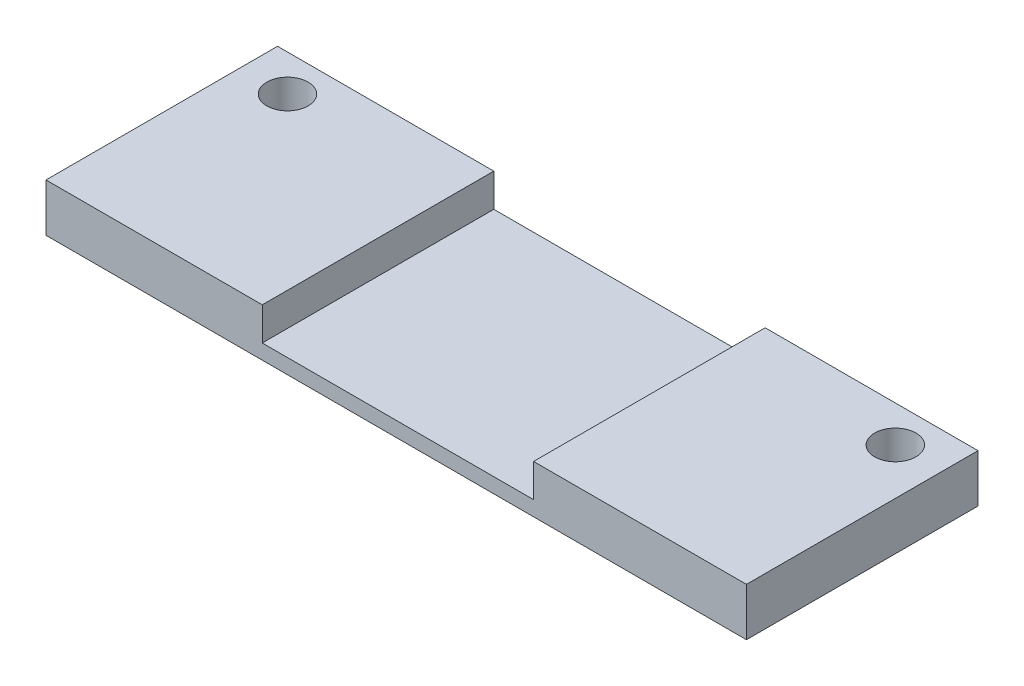
ISO-10303-21;
HEADER;
FILE_DESCRIPTION(('STEP AP214'),'2;1');
FILE_NAME('part.step','',(''),(''),'','','');
FILE_SCHEMA(('AUTOMOTIVE_DESIGN { 1 0 10303 214 1 1 1 1 }'));
ENDSEC;
DATA;
#1=APPLICATION_CONTEXT('core data for automotive mechanical design processes');
#2=APPLICATION_PROTOCOL_DEFINITION('international standard','automotive_design',2000,#1);
#3=PRODUCT_CONTEXT('',#1,'mechanical');
#4=PRODUCT('Part','Part','',(#3));
#5=PRODUCT_RELATED_PRODUCT_CATEGORY('part','',(#4));
#6=PRODUCT_DEFINITION_FORMATION('','',#4);
#7=PRODUCT_DEFINITION_CONTEXT('part definition',#1,'design');
#8=PRODUCT_DEFINITION('design','',#6,#7);
#9=PRODUCT_DEFINITION_SHAPE('','',#8);
#10=(LENGTH_UNIT() NAMED_UNIT(*) SI_UNIT(.MILLI.,.METRE.));
#11=(NAMED_UNIT(*) PLANE_ANGLE_UNIT() SI_UNIT($,.RADIAN.));
#12=(NAMED_UNIT(*) SI_UNIT($,.STERADIAN.) SOLID_ANGLE_UNIT());
#13=UNCERTAINTY_MEASURE_WITH_UNIT(LENGTH_MEASURE(1.E-05),#10,'distance_accuracy_value','');
#14=(GEOMETRIC_REPRESENTATION_CONTEXT(3) GLOBAL_UNCERTAINTY_ASSIGNED_CONTEXT((#13)) GLOBAL_UNIT_ASSIGNED_CONTEXT((#10,
#11,#12)) REPRESENTATION_CONTEXT('',''));
#15=CARTESIAN_POINT('',(0.,0.,0.));
#16=DIRECTION('',(0.,0.,1.));
#17=DIRECTION('',(1.,0.,0.));
#18=AXIS2_PLACEMENT_3D('',#15,#16,#17);
#19=CARTESIAN_POINT('',(-1.43093246882604,2.9,0.));
#20=DIRECTION('',(1.,0.,0.));
#21=DIRECTION('',(0.,0.,-1.));
#22=AXIS2_PLACEMENT_3D('',#19,#20,#21);
#23=PLANE('',#22);
#24=DIRECTION('',(0.,0.,1.));
#25=VECTOR('',#24,1.);
#26=CARTESIAN_POINT('',(-1.43093246882604,0.9,0.));
#27=LINE('',#26,#25);
#28=CARTESIAN_POINT('',(-1.43093246882604,0.9,-5.4506491156257));
#29=VERTEX_POINT('',#28);
#30=CARTESIAN_POINT('',(-1.43093246882604,0.9,8.54935088437429));
#31=VERTEX_POINT('',#30);
#32=EDGE_CURVE('E58',#29,#31,#27,.T.);
#33=ORIENTED_EDGE('',*,*,#32,.F.);
#34=DIRECTION('',(0.,-1.,0.));
#35=VECTOR('',#34,1.);
#36=CARTESIAN_POINT('',(-1.43093246882604,2.9,-5.4506491156257));
#37=LINE('',#36,#35);
#38=CARTESIAN_POINT('',(-1.43093246882604,2.9,-5.4506491156257));
#39=VERTEX_POINT('',#38);
#40=EDGE_CURVE('E11',#39,#29,#37,.T.);
#41=ORIENTED_EDGE('',*,*,#40,.F.);
#42=DIRECTION('',(0.,0.,1.));
#43=VECTOR('',#42,1.);
#44=CARTESIAN_POINT('',(-1.43093246882604,2.9,0.));
#45=LINE('',#44,#43);
#46=CARTESIAN_POINT('',(-1.43093246882604,2.9,8.54935088437429));
#47=VERTEX_POINT('',#46);
#48=EDGE_CURVE('E168',#39,#47,#45,.T.);
#49=ORIENTED_EDGE('',*,*,#48,.T.);
#50=DIRECTION('',(0.,-1.,0.));
#51=VECTOR('',#50,1.);
#52=CARTESIAN_POINT('',(-1.43093246882604,2.9,8.54935088437429));
#53=LINE('',#52,#51);
#54=EDGE_CURVE('E176',#47,#31,#53,.T.);
#55=ORIENTED_EDGE('',*,*,#54,.T.);
#56=EDGE_LOOP('',(#33,#41,#49,#55));
#57=FACE_BOUND('',#56,.T.);
#58=ADVANCED_FACE('F43',(#57),#23,.T.);
#59=CARTESIAN_POINT('',(0.,2.9,-5.45064911562571));
#60=DIRECTION('',(0.,0.,-1.));
#61=DIRECTION('',(-1.,0.,0.));
#62=AXIS2_PLACEMENT_3D('',#59,#60,#61);
#63=PLANE('',#62);
#64=DIRECTION('',(1.,0.,0.));
#65=VECTOR('',#64,1.);
#66=CARTESIAN_POINT('',(0.,0.,-5.45064911562571));
#67=LINE('',#66,#65);
#68=CARTESIAN_POINT('',(-14.505932468826,0.,-5.45064911562571));
#69=VERTEX_POINT('',#68);
#70=CARTESIAN_POINT('',(27.844067531174,0.,-5.45064911562571));
#71=VERTEX_POINT('',#70);
#72=EDGE_CURVE('E179',#69,#71,#67,.T.);
#73=ORIENTED_EDGE('',*,*,#72,.F.);
#74=DIRECTION('',(0.,-1.,0.));
#75=VECTOR('',#74,1.);
#76=CARTESIAN_POINT('',(-14.505932468826,2.9,-5.45064911562571));
#77=LINE('',#76,#75);
#78=CARTESIAN_POINT('',(-14.505932468826,2.9,-5.45064911562571));
#79=VERTEX_POINT('',#78);
#80=EDGE_CURVE('E51',#79,#69,#77,.T.);
#81=ORIENTED_EDGE('',*,*,#80,.F.);
#82=DIRECTION('',(1.,0.,0.));
#83=VECTOR('',#82,1.);
#84=CARTESIAN_POINT('',(0.,2.9,-5.45064911562571));
#85=LINE('',#84,#83);
#86=EDGE_CURVE('E170',#79,#39,#85,.T.);
#87=ORIENTED_EDGE('',*,*,#86,.T.);
#88=ORIENTED_EDGE('',*,*,#40,.T.);
#89=DIRECTION('',(1.,0.,0.));
#90=VECTOR('',#89,1.);
#91=CARTESIAN_POINT('',(0.,0.9,-5.45064911562571));
#92=LINE('',#91,#90);
#93=CARTESIAN_POINT('',(14.9729696775593,0.9,-5.45064911562571));
#94=VERTEX_POINT('',#93);
#95=EDGE_CURVE('E124',#29,#94,#92,.T.);
#96=ORIENTED_EDGE('',*,*,#95,.T.);
#97=DIRECTION('',(0.,-1.,0.));
#98=VECTOR('',#97,1.);
#99=CARTESIAN_POINT('',(14.9729696775593,2.9,-5.45064911562571));
#100=LINE('',#99,#98);
#101=CARTESIAN_POINT('',(14.9729696775593,2.9,-5.45064911562571));
#102=VERTEX_POINT('',#101);
#103=EDGE_CURVE('E115',#102,#94,#100,.T.);
#104=ORIENTED_EDGE('',*,*,#103,.F.);
#105=DIRECTION('',(1.,0.,0.));
#106=VECTOR('',#105,1.);
#107=CARTESIAN_POINT('',(0.,2.9,-5.45064911562571));
#108=LINE('',#107,#106);
#109=CARTESIAN_POINT('',(27.844067531174,2.9,-5.45064911562571));
#110=VERTEX_POINT('',#109);
#111=EDGE_CURVE('E121',#102,#110,#108,.T.);
#112=ORIENTED_EDGE('',*,*,#111,.T.);
#113=DIRECTION('',(0.,-1.,0.));
#114=VECTOR('',#113,1.);
#115=CARTESIAN_POINT('',(27.844067531174,2.9,-5.45064911562571));
#116=LINE('',#115,#114);
#117=EDGE_CURVE('E149',#110,#71,#116,.T.);
#118=ORIENTED_EDGE('',*,*,#117,.T.);
#119=EDGE_LOOP('',(#73,#81,#87,#88,#96,#104,#112,#118));
#120=FACE_BOUND('',#119,.T.);
#121=ADVANCED_FACE('F118',(#120),#63,.T.);
#122=CARTESIAN_POINT('',(-14.505932468826,2.9,0.));
#123=DIRECTION('',(1.,0.,0.));
#124=DIRECTION('',(0.,0.,-1.));
#125=AXIS2_PLACEMENT_3D('',#122,#123,#124);
#126=PLANE('',#125);
#127=DIRECTION('',(0.,0.,1.));
#128=VECTOR('',#127,1.);
#129=CARTESIAN_POINT('',(-14.505932468826,0.,0.));
#130=LINE('',#129,#128);
#131=CARTESIAN_POINT('',(-14.505932468826,0.,8.54935088437429));
#132=VERTEX_POINT('',#131);
#133=EDGE_CURVE('E181',#69,#132,#130,.T.);
#134=ORIENTED_EDGE('',*,*,#133,.T.);
#135=DIRECTION('',(0.,-1.,0.));
#136=VECTOR('',#135,1.);
#137=CARTESIAN_POINT('',(-14.505932468826,2.9,8.54935088437429));
#138=LINE('',#137,#136);
#139=CARTESIAN_POINT('',(-14.505932468826,2.9,8.54935088437429));
#140=VERTEX_POINT('',#139);
#141=EDGE_CURVE('E186',#140,#132,#138,.T.);
#142=ORIENTED_EDGE('',*,*,#141,.F.);
#143=DIRECTION('',(0.,0.,1.));
#144=VECTOR('',#143,1.);
#145=CARTESIAN_POINT('',(-14.505932468826,2.9,0.));
#146=LINE('',#145,#144);
#147=EDGE_CURVE('E173',#79,#140,#146,.T.);
#148=ORIENTED_EDGE('',*,*,#147,.F.);
#149=ORIENTED_EDGE('',*,*,#80,.T.);
#150=EDGE_LOOP('',(#134,#142,#148,#149));
#151=FACE_BOUND('',#150,.T.);
#152=ADVANCED_FACE('F189',(#151),#126,.F.);
#153=CARTESIAN_POINT('',(-11.705932468826,2.9,-3.25064911562571));
#154=DIRECTION('',(0.,-1.,0.));
#155=DIRECTION('',(0.,0.,-1.));
#156=AXIS2_PLACEMENT_3D('',#153,#154,#155);
#157=CYLINDRICAL_SURFACE('',#156,1.25);
#158=CARTESIAN_POINT('',(-11.705932468826,2.9,-3.25064911562571));
#159=DIRECTION('',(0.,1.,0.));
#160=DIRECTION('',(0.,0.,1.));
#161=AXIS2_PLACEMENT_3D('',#158,#159,#160);
#162=CIRCLE('',#161,1.25);
#163=CARTESIAN_POINT('',(-11.705932468826,2.9,-2.00064911562571));
#164=VERTEX_POINT('',#163);
#165=EDGE_CURVE('E165',#164,#164,#162,.T.);
#166=ORIENTED_EDGE('',*,*,#165,.T.);
#167=EDGE_LOOP('',(#166));
#168=FACE_BOUND('',#167,.T.);
#169=CARTESIAN_POINT('',(-11.705932468826,0.,-3.25064911562571));
#170=DIRECTION('',(0.,1.,0.));
#171=DIRECTION('',(0.,0.,1.));
#172=AXIS2_PLACEMENT_3D('',#169,#170,#171);
#173=CIRCLE('',#172,1.25);
#174=CARTESIAN_POINT('',(-11.705932468826,0.,-2.00064911562571));
#175=VERTEX_POINT('',#174);
#176=EDGE_CURVE('E164',#175,#175,#173,.T.);
#177=ORIENTED_EDGE('',*,*,#176,.F.);
#178=EDGE_LOOP('',(#177));
#179=FACE_BOUND('',#178,.T.);
#180=ADVANCED_FACE('F45',(#168,#179),#157,.F.);
#181=CARTESIAN_POINT('',(0.,2.9,8.54935088437429));
#182=DIRECTION('',(0.,0.,-1.));
#183=DIRECTION('',(-1.,0.,0.));
#184=AXIS2_PLACEMENT_3D('',#181,#182,#183);
#185=PLANE('',#184);
#186=DIRECTION('',(1.,0.,0.));
#187=VECTOR('',#186,1.);
#188=CARTESIAN_POINT('',(0.,0.,8.54935088437429));
#189=LINE('',#188,#187);
#190=CARTESIAN_POINT('',(27.844067531174,0.,8.54935088437429));
#191=VERTEX_POINT('',#190);
#192=EDGE_CURVE('E82',#132,#191,#189,.T.);
#193=ORIENTED_EDGE('',*,*,#192,.T.);
#194=DIRECTION('',(0.,-1.,0.));
#195=VECTOR('',#194,1.);
#196=CARTESIAN_POINT('',(27.844067531174,2.9,8.54935088437429));
#197=LINE('',#196,#195);
#198=CARTESIAN_POINT('',(27.844067531174,2.9,8.54935088437429));
#199=VERTEX_POINT('',#198);
#200=EDGE_CURVE('E155',#199,#191,#197,.T.);
#201=ORIENTED_EDGE('',*,*,#200,.F.);
#202=DIRECTION('',(1.,0.,0.));
#203=VECTOR('',#202,1.);
#204=CARTESIAN_POINT('',(0.,2.9,8.54935088437429));
#205=LINE('',#204,#203);
#206=CARTESIAN_POINT('',(14.9729696775593,2.9,8.54935088437429));
#207=VERTEX_POINT('',#206);
#208=EDGE_CURVE('E136',#207,#199,#205,.T.);
#209=ORIENTED_EDGE('',*,*,#208,.F.);
#210=DIRECTION('',(0.,-1.,0.));
#211=VECTOR('',#210,1.);
#212=CARTESIAN_POINT('',(14.9729696775593,2.9,8.54935088437429));
#213=LINE('',#212,#211);
#214=CARTESIAN_POINT('',(14.9729696775593,0.9,8.54935088437429));
#215=VERTEX_POINT('',#214);
#216=EDGE_CURVE('E128',#207,#215,#213,.T.);
#217=ORIENTED_EDGE('',*,*,#216,.T.);
#218=DIRECTION('',(1.,0.,0.));
#219=VECTOR('',#218,1.);
#220=CARTESIAN_POINT('',(0.,0.9,8.54935088437429));
#221=LINE('',#220,#219);
#222=EDGE_CURVE('E162',#31,#215,#221,.T.);
#223=ORIENTED_EDGE('',*,*,#222,.F.);
#224=ORIENTED_EDGE('',*,*,#54,.F.);
#225=DIRECTION('',(1.,0.,0.));
#226=VECTOR('',#225,1.);
#227=CARTESIAN_POINT('',(0.,2.9,8.54935088437429));
#228=LINE('',#227,#226);
#229=EDGE_CURVE('E66',#140,#47,#228,.T.);
#230=ORIENTED_EDGE('',*,*,#229,.F.);
#231=ORIENTED_EDGE('',*,*,#141,.T.);
#232=EDGE_LOOP('',(#193,#201,#209,#217,#223,#224,#230,#231));
#233=FACE_BOUND('',#232,.T.);
#234=ADVANCED_FACE('F199',(#233),#185,.F.);
#235=CARTESIAN_POINT('',(0.,2.9,0.));
#236=DIRECTION('',(0.,1.,0.));
#237=DIRECTION('',(0.,0.,1.));
#238=AXIS2_PLACEMENT_3D('',#235,#236,#237);
#239=PLANE('',#238);
#240=ORIENTED_EDGE('',*,*,#165,.F.);
#241=EDGE_LOOP('',(#240));
#242=FACE_BOUND('',#241,.T.);
#243=ORIENTED_EDGE('',*,*,#48,.F.);
#244=ORIENTED_EDGE('',*,*,#86,.F.);
#245=ORIENTED_EDGE('',*,*,#147,.T.);
#246=ORIENTED_EDGE('',*,*,#229,.T.);
#247=EDGE_LOOP('',(#243,#244,#245,#246));
#248=FACE_BOUND('',#247,.T.);
#249=ADVANCED_FACE('F201',(#242,#248),#239,.T.);
#250=CARTESIAN_POINT('',(0.,0.,0.));
#251=DIRECTION('',(0.,1.,0.));
#252=DIRECTION('',(0.,0.,1.));
#253=AXIS2_PLACEMENT_3D('',#250,#251,#252);
#254=PLANE('',#253);
#255=ORIENTED_EDGE('',*,*,#176,.T.);
#256=EDGE_LOOP('',(#255));
#257=FACE_BOUND('',#256,.T.);
#258=ORIENTED_EDGE('',*,*,#72,.T.);
#259=DIRECTION('',(0.,0.,1.));
#260=VECTOR('',#259,1.);
#261=CARTESIAN_POINT('',(27.844067531174,0.,0.));
#262=LINE('',#261,#260);
#263=EDGE_CURVE('E144',#71,#191,#262,.T.);
#264=ORIENTED_EDGE('',*,*,#263,.T.);
#265=ORIENTED_EDGE('',*,*,#192,.F.);
#266=ORIENTED_EDGE('',*,*,#133,.F.);
#267=EDGE_LOOP('',(#258,#264,#265,#266));
#268=FACE_BOUND('',#267,.T.);
#269=CARTESIAN_POINT('',(25.044067531174,0.,-3.25064911562571));
#270=DIRECTION('',(0.,1.,0.));
#271=DIRECTION('',(0.,0.,1.));
#272=AXIS2_PLACEMENT_3D('',#269,#270,#271);
#273=CIRCLE('',#272,1.25);
#274=CARTESIAN_POINT('',(25.044067531174,0.,-2.00064911562571));
#275=VERTEX_POINT('',#274);
#276=EDGE_CURVE('E150',#275,#275,#273,.T.);
#277=ORIENTED_EDGE('',*,*,#276,.T.);
#278=EDGE_LOOP('',(#277));
#279=FACE_BOUND('',#278,.T.);
#280=ADVANCED_FACE('F192',(#257,#268,#279),#254,.F.);
#281=CARTESIAN_POINT('',(0.,0.9,0.));
#282=DIRECTION('',(0.,1.,0.));
#283=DIRECTION('',(0.,0.,1.));
#284=AXIS2_PLACEMENT_3D('',#281,#282,#283);
#285=PLANE('',#284);
#286=DIRECTION('',(0.,0.,1.));
#287=VECTOR('',#286,1.);
#288=CARTESIAN_POINT('',(14.9729696775593,0.9,0.));
#289=LINE('',#288,#287);
#290=EDGE_CURVE('E127',#94,#215,#289,.T.);
#291=ORIENTED_EDGE('',*,*,#290,.F.);
#292=ORIENTED_EDGE('',*,*,#95,.F.);
#293=ORIENTED_EDGE('',*,*,#32,.T.);
#294=ORIENTED_EDGE('',*,*,#222,.T.);
#295=EDGE_LOOP('',(#291,#292,#293,#294));
#296=FACE_BOUND('',#295,.T.);
#297=ADVANCED_FACE('F203',(#296),#285,.T.);
#298=CARTESIAN_POINT('',(14.9729696775593,2.9,0.));
#299=DIRECTION('',(1.,0.,0.));
#300=DIRECTION('',(0.,0.,-1.));
#301=AXIS2_PLACEMENT_3D('',#298,#299,#300);
#302=PLANE('',#301);
#303=ORIENTED_EDGE('',*,*,#103,.T.);
#304=ORIENTED_EDGE('',*,*,#290,.T.);
#305=ORIENTED_EDGE('',*,*,#216,.F.);
#306=DIRECTION('',(0.,0.,1.));
#307=VECTOR('',#306,1.);
#308=CARTESIAN_POINT('',(14.9729696775593,2.9,0.));
#309=LINE('',#308,#307);
#310=EDGE_CURVE('E132',#102,#207,#309,.T.);
#311=ORIENTED_EDGE('',*,*,#310,.F.);
#312=EDGE_LOOP('',(#303,#304,#305,#311));
#313=FACE_BOUND('',#312,.T.);
#314=ADVANCED_FACE('F133',(#313),#302,.F.);
#315=CARTESIAN_POINT('',(25.044067531174,2.9,-3.25064911562571));
#316=DIRECTION('',(0.,-1.,0.));
#317=DIRECTION('',(0.,0.,-1.));
#318=AXIS2_PLACEMENT_3D('',#315,#316,#317);
#319=CYLINDRICAL_SURFACE('',#318,1.25);
#320=CARTESIAN_POINT('',(25.044067531174,2.9,-3.25064911562571));
#321=DIRECTION('',(0.,1.,0.));
#322=DIRECTION('',(0.,0.,1.));
#323=AXIS2_PLACEMENT_3D('',#320,#321,#322);
#324=CIRCLE('',#323,1.25);
#325=CARTESIAN_POINT('',(25.044067531174,2.9,-2.00064911562571));
#326=VERTEX_POINT('',#325);
#327=EDGE_CURVE('E141',#326,#326,#324,.T.);
#328=ORIENTED_EDGE('',*,*,#327,.T.);
#329=EDGE_LOOP('',(#328));
#330=FACE_BOUND('',#329,.T.);
#331=ORIENTED_EDGE('',*,*,#276,.F.);
#332=EDGE_LOOP('',(#331));
#333=FACE_BOUND('',#332,.T.);
#334=ADVANCED_FACE('F210',(#330,#333),#319,.F.);
#335=CARTESIAN_POINT('',(27.844067531174,2.9,0.));
#336=DIRECTION('',(1.,0.,0.));
#337=DIRECTION('',(0.,0.,-1.));
#338=AXIS2_PLACEMENT_3D('',#335,#336,#337);
#339=PLANE('',#338);
#340=ORIENTED_EDGE('',*,*,#263,.F.);
#341=ORIENTED_EDGE('',*,*,#117,.F.);
#342=DIRECTION('',(0.,0.,1.));
#343=VECTOR('',#342,1.);
#344=CARTESIAN_POINT('',(27.844067531174,2.9,0.));
#345=LINE('',#344,#343);
#346=EDGE_CURVE('E140',#110,#199,#345,.T.);
#347=ORIENTED_EDGE('',*,*,#346,.T.);
#348=ORIENTED_EDGE('',*,*,#200,.T.);
#349=EDGE_LOOP('',(#340,#341,#347,#348));
#350=FACE_BOUND('',#349,.T.);
#351=ADVANCED_FACE('F196',(#350),#339,.T.);
#352=CARTESIAN_POINT('',(0.,2.9,0.));
#353=DIRECTION('',(0.,1.,0.));
#354=DIRECTION('',(0.,0.,1.));
#355=AXIS2_PLACEMENT_3D('',#352,#353,#354);
#356=PLANE('',#355);
#357=ORIENTED_EDGE('',*,*,#327,.F.);
#358=EDGE_LOOP('',(#357));
#359=FACE_BOUND('',#358,.T.);
#360=ORIENTED_EDGE('',*,*,#111,.F.);
#361=ORIENTED_EDGE('',*,*,#310,.T.);
#362=ORIENTED_EDGE('',*,*,#208,.T.);
#363=ORIENTED_EDGE('',*,*,#346,.F.);
#364=EDGE_LOOP('',(#360,#361,#362,#363));
#365=FACE_BOUND('',#364,.T.);
#366=ADVANCED_FACE('F138',(#359,#365),#356,.T.);
#367=CLOSED_SHELL('',(#58,#121,#152,#180,#234,#249,#280,#297,#314,#334,#351,#366));
#368=MANIFOLD_SOLID_BREP('B2',#367);
#369=ADVANCED_BREP_SHAPE_REPRESENTATION('',(#18,#368),#14);
#370=SHAPE_DEFINITION_REPRESENTATION(#9,#369);
ENDSEC;
END-ISO-10303-21;
